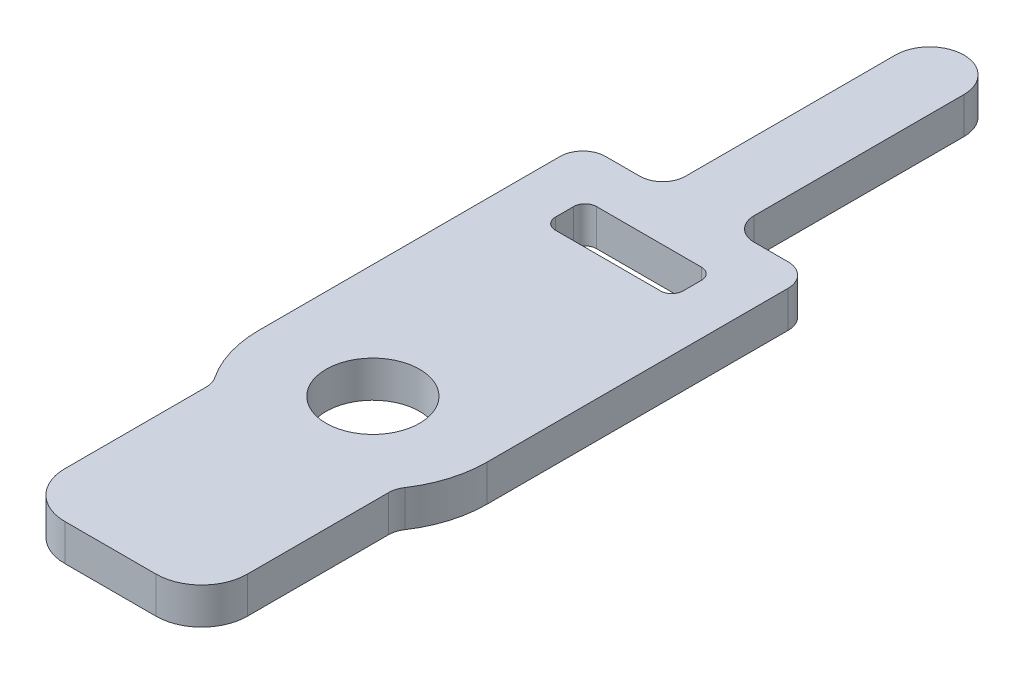
ISO-10303-21;
HEADER;
FILE_DESCRIPTION(('STEP AP214'),'2;1');
FILE_NAME('part.step','',(''),(''),'','','');
FILE_SCHEMA(('AUTOMOTIVE_DESIGN { 1 0 10303 214 1 1 1 1 }'));
ENDSEC;
DATA;
#1=APPLICATION_CONTEXT('core data for automotive mechanical design processes');
#2=APPLICATION_PROTOCOL_DEFINITION('international standard','automotive_design',2000,#1);
#3=PRODUCT_CONTEXT('',#1,'mechanical');
#4=PRODUCT('Part','Part','',(#3));
#5=PRODUCT_RELATED_PRODUCT_CATEGORY('part','',(#4));
#6=PRODUCT_DEFINITION_FORMATION('','',#4);
#7=PRODUCT_DEFINITION_CONTEXT('part definition',#1,'design');
#8=PRODUCT_DEFINITION('design','',#6,#7);
#9=PRODUCT_DEFINITION_SHAPE('','',#8);
#10=(LENGTH_UNIT() NAMED_UNIT(*) SI_UNIT(.MILLI.,.METRE.));
#11=(NAMED_UNIT(*) PLANE_ANGLE_UNIT() SI_UNIT($,.RADIAN.));
#12=(NAMED_UNIT(*) SI_UNIT($,.STERADIAN.) SOLID_ANGLE_UNIT());
#13=UNCERTAINTY_MEASURE_WITH_UNIT(LENGTH_MEASURE(1.E-05),#10,'distance_accuracy_value','');
#14=(GEOMETRIC_REPRESENTATION_CONTEXT(3) GLOBAL_UNCERTAINTY_ASSIGNED_CONTEXT((#13)) GLOBAL_UNIT_ASSIGNED_CONTEXT((#10,
#11,#12)) REPRESENTATION_CONTEXT('',''));
#15=CARTESIAN_POINT('',(0.,0.,0.));
#16=DIRECTION('',(0.,0.,1.));
#17=DIRECTION('',(1.,0.,0.));
#18=AXIS2_PLACEMENT_3D('',#15,#16,#17);
#19=CARTESIAN_POINT('',(0.,1.6,0.));
#20=DIRECTION('',(0.,0.,-1.));
#21=DIRECTION('',(-1.,0.,0.));
#22=AXIS2_PLACEMENT_3D('',#19,#20,#21);
#23=PLANE('',#22);
#24=DIRECTION('',(1.,0.,0.));
#25=VECTOR('',#24,1.);
#26=CARTESIAN_POINT('',(0.,0.,0.));
#27=LINE('',#26,#25);
#28=CARTESIAN_POINT('',(-2.00000000000001,0.,0.));
#29=VERTEX_POINT('',#28);
#30=CARTESIAN_POINT('',(2.00000000000001,0.,0.));
#31=VERTEX_POINT('',#30);
#32=EDGE_CURVE('E335',#29,#31,#27,.T.);
#33=ORIENTED_EDGE('',*,*,#32,.T.);
#34=DIRECTION('',(0.,-1.,0.));
#35=VECTOR('',#34,1.);
#36=CARTESIAN_POINT('',(2.00000000000001,1.6,0.));
#37=LINE('',#36,#35);
#38=CARTESIAN_POINT('',(2.00000000000001,1.6,0.));
#39=VERTEX_POINT('',#38);
#40=EDGE_CURVE('E396',#31,#39,#37,.F.);
#41=ORIENTED_EDGE('',*,*,#40,.T.);
#42=DIRECTION('',(1.,0.,0.));
#43=VECTOR('',#42,1.);
#44=CARTESIAN_POINT('',(0.,1.6,0.));
#45=LINE('',#44,#43);
#46=CARTESIAN_POINT('',(-2.00000000000001,1.6,0.));
#47=VERTEX_POINT('',#46);
#48=EDGE_CURVE('E336',#47,#39,#45,.T.);
#49=ORIENTED_EDGE('',*,*,#48,.F.);
#50=DIRECTION('',(0.,-1.,0.));
#51=VECTOR('',#50,1.);
#52=CARTESIAN_POINT('',(-2.00000000000001,1.6,0.));
#53=LINE('',#52,#51);
#54=EDGE_CURVE('E279',#29,#47,#53,.F.);
#55=ORIENTED_EDGE('',*,*,#54,.F.);
#56=EDGE_LOOP('',(#33,#41,#49,#55));
#57=FACE_BOUND('',#56,.T.);
#58=ADVANCED_FACE('F35',(#57),#23,.F.);
#59=CARTESIAN_POINT('',(4.00000000000001,1.6,0.));
#60=DIRECTION('',(-1.,0.,0.));
#61=DIRECTION('',(0.,0.,1.));
#62=AXIS2_PLACEMENT_3D('',#59,#60,#61);
#63=PLANE('',#62);
#64=DIRECTION('',(0.,0.,-1.));
#65=VECTOR('',#64,1.);
#66=CARTESIAN_POINT('',(4.00000000000001,0.,0.));
#67=LINE('',#66,#65);
#68=CARTESIAN_POINT('',(4.00000000000001,0.,-2.));
#69=VERTEX_POINT('',#68);
#70=CARTESIAN_POINT('',(4.00000000000001,0.,-8.1833752096446));
#71=VERTEX_POINT('',#70);
#72=EDGE_CURVE('E366',#69,#71,#67,.T.);
#73=ORIENTED_EDGE('',*,*,#72,.T.);
#74=DIRECTION('',(0.,1.,0.));
#75=VECTOR('',#74,1.);
#76=CARTESIAN_POINT('',(4.00000000000001,1.6,-8.1833752096446));
#77=LINE('',#76,#75);
#78=CARTESIAN_POINT('',(4.00000000000001,1.6,-8.1833752096446));
#79=VERTEX_POINT('',#78);
#80=EDGE_CURVE('E411',#71,#79,#77,.T.);
#81=ORIENTED_EDGE('',*,*,#80,.T.);
#82=DIRECTION('',(0.,0.,-1.));
#83=VECTOR('',#82,1.);
#84=CARTESIAN_POINT('',(4.00000000000001,1.6,0.));
#85=LINE('',#84,#83);
#86=CARTESIAN_POINT('',(4.00000000000001,1.6,-2.));
#87=VERTEX_POINT('',#86);
#88=EDGE_CURVE('E339',#87,#79,#85,.T.);
#89=ORIENTED_EDGE('',*,*,#88,.F.);
#90=DIRECTION('',(0.,-1.,0.));
#91=VECTOR('',#90,1.);
#92=CARTESIAN_POINT('',(4.00000000000001,1.6,-2.));
#93=LINE('',#92,#91);
#94=EDGE_CURVE('E391',#87,#69,#93,.T.);
#95=ORIENTED_EDGE('',*,*,#94,.T.);
#96=EDGE_LOOP('',(#73,#81,#89,#95));
#97=FACE_BOUND('',#96,.T.);
#98=ADVANCED_FACE('F490',(#97),#63,.F.);
#99=CARTESIAN_POINT('',(0.,1.6,-11.5));
#100=DIRECTION('',(0.,-1.,0.));
#101=DIRECTION('',(0.,0.,-1.));
#102=AXIS2_PLACEMENT_3D('',#99,#100,#101);
#103=CYLINDRICAL_SURFACE('',#102,5.);
#104=CARTESIAN_POINT('',(0.,1.6,-11.5));
#105=DIRECTION('',(0.,1.,0.));
#106=DIRECTION('',(0.,0.,1.));
#107=AXIS2_PLACEMENT_3D('',#104,#105,#106);
#108=CIRCLE('',#107,5.);
#109=CARTESIAN_POINT('',(4.16666666666667,1.6,-8.73614600803717));
#110=VERTEX_POINT('',#109);
#111=CARTESIAN_POINT('',(5.,1.6,-11.5));
#112=VERTEX_POINT('',#111);
#113=EDGE_CURVE('E343',#110,#112,#108,.T.);
#114=ORIENTED_EDGE('',*,*,#113,.F.);
#115=DIRECTION('',(0.,-1.,0.));
#116=VECTOR('',#115,1.);
#117=CARTESIAN_POINT('',(4.16666666666667,1.6,-8.73614600803717));
#118=LINE('',#117,#116);
#119=CARTESIAN_POINT('',(4.16666666666667,0.,-8.73614600803717));
#120=VERTEX_POINT('',#119);
#121=EDGE_CURVE('E408',#110,#120,#118,.T.);
#122=ORIENTED_EDGE('',*,*,#121,.T.);
#123=CARTESIAN_POINT('',(0.,0.,-11.5));
#124=DIRECTION('',(0.,1.,0.));
#125=DIRECTION('',(0.,0.,1.));
#126=AXIS2_PLACEMENT_3D('',#123,#124,#125);
#127=CIRCLE('',#126,5.);
#128=CARTESIAN_POINT('',(5.,0.,-11.5));
#129=VERTEX_POINT('',#128);
#130=EDGE_CURVE('E369',#120,#129,#127,.T.);
#131=ORIENTED_EDGE('',*,*,#130,.T.);
#132=DIRECTION('',(0.,-1.,0.));
#133=VECTOR('',#132,1.);
#134=CARTESIAN_POINT('',(5.,1.6,-11.5));
#135=LINE('',#134,#133);
#136=EDGE_CURVE('E363',#112,#129,#135,.T.);
#137=ORIENTED_EDGE('',*,*,#136,.F.);
#138=EDGE_LOOP('',(#114,#122,#131,#137));
#139=FACE_BOUND('',#138,.T.);
#140=ADVANCED_FACE('F496',(#139),#103,.T.);
#141=CARTESIAN_POINT('',(5.,1.6,-25.7));
#142=DIRECTION('',(-1.,0.,0.));
#143=DIRECTION('',(0.,0.,1.));
#144=AXIS2_PLACEMENT_3D('',#141,#142,#143);
#145=PLANE('',#144);
#146=DIRECTION('',(0.,0.,-1.));
#147=VECTOR('',#146,1.);
#148=CARTESIAN_POINT('',(5.,0.,-25.7));
#149=LINE('',#148,#147);
#150=CARTESIAN_POINT('',(5.,0.,-24.7));
#151=VERTEX_POINT('',#150);
#152=EDGE_CURVE('E371',#129,#151,#149,.T.);
#153=ORIENTED_EDGE('',*,*,#152,.T.);
#154=DIRECTION('',(0.,-1.,0.));
#155=VECTOR('',#154,1.);
#156=CARTESIAN_POINT('',(5.,1.6,-24.7));
#157=LINE('',#156,#155);
#158=CARTESIAN_POINT('',(5.,1.6,-24.7));
#159=VERTEX_POINT('',#158);
#160=EDGE_CURVE('E420',#151,#159,#157,.F.);
#161=ORIENTED_EDGE('',*,*,#160,.T.);
#162=DIRECTION('',(0.,0.,-1.));
#163=VECTOR('',#162,1.);
#164=CARTESIAN_POINT('',(5.,1.6,-25.7));
#165=LINE('',#164,#163);
#166=EDGE_CURVE('E345',#112,#159,#165,.T.);
#167=ORIENTED_EDGE('',*,*,#166,.F.);
#168=ORIENTED_EDGE('',*,*,#136,.T.);
#169=EDGE_LOOP('',(#153,#161,#167,#168));
#170=FACE_BOUND('',#169,.T.);
#171=ADVANCED_FACE('F574',(#170),#145,.F.);
#172=CARTESIAN_POINT('',(5.,1.6,-25.7));
#173=DIRECTION('',(0.,0.,1.));
#174=DIRECTION('',(1.,0.,0.));
#175=AXIS2_PLACEMENT_3D('',#172,#173,#174);
#176=PLANE('',#175);
#177=DIRECTION('',(-1.,0.,0.));
#178=VECTOR('',#177,1.);
#179=CARTESIAN_POINT('',(5.,1.6,-25.7));
#180=LINE('',#179,#178);
#181=CARTESIAN_POINT('',(4.,1.6,-25.7));
#182=VERTEX_POINT('',#181);
#183=CARTESIAN_POINT('',(2.5,1.6,-25.7));
#184=VERTEX_POINT('',#183);
#185=EDGE_CURVE('E348',#182,#184,#180,.T.);
#186=ORIENTED_EDGE('',*,*,#185,.F.);
#187=DIRECTION('',(0.,-1.,0.));
#188=VECTOR('',#187,1.);
#189=CARTESIAN_POINT('',(4.,1.6,-25.7));
#190=LINE('',#189,#188);
#191=CARTESIAN_POINT('',(4.,0.,-25.7));
#192=VERTEX_POINT('',#191);
#193=EDGE_CURVE('E415',#182,#192,#190,.T.);
#194=ORIENTED_EDGE('',*,*,#193,.T.);
#195=DIRECTION('',(-1.,0.,0.));
#196=VECTOR('',#195,1.);
#197=CARTESIAN_POINT('',(5.,0.,-25.7));
#198=LINE('',#197,#196);
#199=CARTESIAN_POINT('',(2.5,0.,-25.7));
#200=VERTEX_POINT('',#199);
#201=EDGE_CURVE('E374',#192,#200,#198,.T.);
#202=ORIENTED_EDGE('',*,*,#201,.T.);
#203=DIRECTION('',(0.,-1.,0.));
#204=VECTOR('',#203,1.);
#205=CARTESIAN_POINT('',(2.5,1.6,-25.7));
#206=LINE('',#205,#204);
#207=EDGE_CURVE('E413',#200,#184,#206,.F.);
#208=ORIENTED_EDGE('',*,*,#207,.T.);
#209=EDGE_LOOP('',(#186,#194,#202,#208));
#210=FACE_BOUND('',#209,.T.);
#211=ADVANCED_FACE('F524',(#210),#176,.F.);
#212=CARTESIAN_POINT('',(1.5,1.6,-25.7));
#213=DIRECTION('',(-1.,0.,0.));
#214=DIRECTION('',(0.,0.,1.));
#215=AXIS2_PLACEMENT_3D('',#212,#213,#214);
#216=PLANE('',#215);
#217=DIRECTION('',(0.,0.,-1.));
#218=VECTOR('',#217,1.);
#219=CARTESIAN_POINT('',(1.5,1.6,-25.7));
#220=LINE('',#219,#218);
#221=CARTESIAN_POINT('',(1.5,1.6,-26.7));
#222=VERTEX_POINT('',#221);
#223=CARTESIAN_POINT('',(1.5,1.6,-35.9));
#224=VERTEX_POINT('',#223);
#225=EDGE_CURVE('E351',#222,#224,#220,.T.);
#226=ORIENTED_EDGE('',*,*,#225,.F.);
#227=DIRECTION('',(0.,-1.,0.));
#228=VECTOR('',#227,1.);
#229=CARTESIAN_POINT('',(1.5,0.,-26.7));
#230=LINE('',#229,#228);
#231=CARTESIAN_POINT('',(1.5,0.,-26.7));
#232=VERTEX_POINT('',#231);
#233=EDGE_CURVE('E424',#222,#232,#230,.T.);
#234=ORIENTED_EDGE('',*,*,#233,.T.);
#235=DIRECTION('',(0.,0.,-1.));
#236=VECTOR('',#235,1.);
#237=CARTESIAN_POINT('',(1.5,0.,-25.7));
#238=LINE('',#237,#236);
#239=CARTESIAN_POINT('',(1.5,0.,-35.9));
#240=VERTEX_POINT('',#239);
#241=EDGE_CURVE('E377',#232,#240,#238,.T.);
#242=ORIENTED_EDGE('',*,*,#241,.T.);
#243=DIRECTION('',(0.,-1.,0.));
#244=VECTOR('',#243,1.);
#245=CARTESIAN_POINT('',(1.5,1.6,-35.9));
#246=LINE('',#245,#244);
#247=EDGE_CURVE('E403',#240,#224,#246,.F.);
#248=ORIENTED_EDGE('',*,*,#247,.T.);
#249=EDGE_LOOP('',(#226,#234,#242,#248));
#250=FACE_BOUND('',#249,.T.);
#251=ADVANCED_FACE('F530',(#250),#216,.F.);
#252=CARTESIAN_POINT('',(2.8,1.6,-23.6));
#253=DIRECTION('',(0.,0.,-1.));
#254=DIRECTION('',(-1.,0.,0.));
#255=AXIS2_PLACEMENT_3D('',#252,#253,#254);
#256=PLANE('',#255);
#257=DIRECTION('',(1.,0.,0.));
#258=VECTOR('',#257,1.);
#259=CARTESIAN_POINT('',(2.8,0.,-23.6));
#260=LINE('',#259,#258);
#261=CARTESIAN_POINT('',(-2.30000000000001,0.,-23.6));
#262=VERTEX_POINT('',#261);
#263=CARTESIAN_POINT('',(2.3,0.,-23.6));
#264=VERTEX_POINT('',#263);
#265=EDGE_CURVE('E379',#262,#264,#260,.T.);
#266=ORIENTED_EDGE('',*,*,#265,.T.);
#267=DIRECTION('',(0.,-1.,0.));
#268=VECTOR('',#267,1.);
#269=CARTESIAN_POINT('',(2.3,1.6,-23.6));
#270=LINE('',#269,#268);
#271=CARTESIAN_POINT('',(2.3,1.6,-23.6));
#272=VERTEX_POINT('',#271);
#273=EDGE_CURVE('E440',#264,#272,#270,.F.);
#274=ORIENTED_EDGE('',*,*,#273,.T.);
#275=DIRECTION('',(1.,0.,0.));
#276=VECTOR('',#275,1.);
#277=CARTESIAN_POINT('',(2.8,1.6,-23.6));
#278=LINE('',#277,#276);
#279=CARTESIAN_POINT('',(-2.30000000000001,1.6,-23.6));
#280=VERTEX_POINT('',#279);
#281=EDGE_CURVE('E353',#280,#272,#278,.T.);
#282=ORIENTED_EDGE('',*,*,#281,.F.);
#283=DIRECTION('',(0.,-1.,0.));
#284=VECTOR('',#283,1.);
#285=CARTESIAN_POINT('',(-2.30000000000001,1.6,-23.6));
#286=LINE('',#285,#284);
#287=EDGE_CURVE('E319',#262,#280,#286,.F.);
#288=ORIENTED_EDGE('',*,*,#287,.F.);
#289=EDGE_LOOP('',(#266,#274,#282,#288));
#290=FACE_BOUND('',#289,.T.);
#291=ADVANCED_FACE('F475',(#290),#256,.F.);
#292=CARTESIAN_POINT('',(2.8,1.6,-21.8));
#293=DIRECTION('',(1.,0.,0.));
#294=DIRECTION('',(0.,0.,-1.));
#295=AXIS2_PLACEMENT_3D('',#292,#293,#294);
#296=PLANE('',#295);
#297=DIRECTION('',(0.,0.,1.));
#298=VECTOR('',#297,1.);
#299=CARTESIAN_POINT('',(2.8,1.6,-21.8));
#300=LINE('',#299,#298);
#301=CARTESIAN_POINT('',(2.8,1.6,-23.1));
#302=VERTEX_POINT('',#301);
#303=CARTESIAN_POINT('',(2.8,1.6,-22.3));
#304=VERTEX_POINT('',#303);
#305=EDGE_CURVE('E356',#302,#304,#300,.T.);
#306=ORIENTED_EDGE('',*,*,#305,.F.);
#307=DIRECTION('',(0.,-1.,0.));
#308=VECTOR('',#307,1.);
#309=CARTESIAN_POINT('',(2.8,0.,-23.1));
#310=LINE('',#309,#308);
#311=CARTESIAN_POINT('',(2.8,0.,-23.1));
#312=VERTEX_POINT('',#311);
#313=EDGE_CURVE('E437',#302,#312,#310,.T.);
#314=ORIENTED_EDGE('',*,*,#313,.T.);
#315=DIRECTION('',(0.,0.,1.));
#316=VECTOR('',#315,1.);
#317=CARTESIAN_POINT('',(2.8,0.,-21.8));
#318=LINE('',#317,#316);
#319=CARTESIAN_POINT('',(2.8,0.,-22.3));
#320=VERTEX_POINT('',#319);
#321=EDGE_CURVE('E382',#312,#320,#318,.T.);
#322=ORIENTED_EDGE('',*,*,#321,.T.);
#323=DIRECTION('',(0.,-1.,0.));
#324=VECTOR('',#323,1.);
#325=CARTESIAN_POINT('',(2.8,1.6,-22.3));
#326=LINE('',#325,#324);
#327=EDGE_CURVE('E435',#320,#304,#326,.F.);
#328=ORIENTED_EDGE('',*,*,#327,.T.);
#329=EDGE_LOOP('',(#306,#314,#322,#328));
#330=FACE_BOUND('',#329,.T.);
#331=ADVANCED_FACE('F455',(#330),#296,.F.);
#332=CARTESIAN_POINT('',(2.8,1.6,-21.8));
#333=DIRECTION('',(0.,0.,1.));
#334=DIRECTION('',(1.,0.,0.));
#335=AXIS2_PLACEMENT_3D('',#332,#333,#334);
#336=PLANE('',#335);
#337=DIRECTION('',(-1.,0.,0.));
#338=VECTOR('',#337,1.);
#339=CARTESIAN_POINT('',(2.8,1.6,-21.8));
#340=LINE('',#339,#338);
#341=CARTESIAN_POINT('',(2.3,1.6,-21.8));
#342=VERTEX_POINT('',#341);
#343=CARTESIAN_POINT('',(-2.30000000000001,1.6,-21.8));
#344=VERTEX_POINT('',#343);
#345=EDGE_CURVE('E358',#342,#344,#340,.T.);
#346=ORIENTED_EDGE('',*,*,#345,.F.);
#347=DIRECTION('',(0.,-1.,0.));
#348=VECTOR('',#347,1.);
#349=CARTESIAN_POINT('',(2.3,0.,-21.8));
#350=LINE('',#349,#348);
#351=CARTESIAN_POINT('',(2.3,0.,-21.8));
#352=VERTEX_POINT('',#351);
#353=EDGE_CURVE('E442',#342,#352,#350,.T.);
#354=ORIENTED_EDGE('',*,*,#353,.T.);
#355=DIRECTION('',(-1.,0.,0.));
#356=VECTOR('',#355,1.);
#357=CARTESIAN_POINT('',(2.8,0.,-21.8));
#358=LINE('',#357,#356);
#359=CARTESIAN_POINT('',(-2.30000000000001,0.,-21.8));
#360=VERTEX_POINT('',#359);
#361=EDGE_CURVE('E385',#352,#360,#358,.T.);
#362=ORIENTED_EDGE('',*,*,#361,.T.);
#363=DIRECTION('',(0.,-1.,0.));
#364=VECTOR('',#363,1.);
#365=CARTESIAN_POINT('',(-2.30000000000001,0.,-21.8));
#366=LINE('',#365,#364);
#367=EDGE_CURVE('E322',#344,#360,#366,.T.);
#368=ORIENTED_EDGE('',*,*,#367,.F.);
#369=EDGE_LOOP('',(#346,#354,#362,#368));
#370=FACE_BOUND('',#369,.T.);
#371=ADVANCED_FACE('F458',(#370),#336,.F.);
#372=CARTESIAN_POINT('',(0.,1.6,-11.5));
#373=DIRECTION('',(0.,-1.,0.));
#374=DIRECTION('',(0.,0.,-1.));
#375=AXIS2_PLACEMENT_3D('',#372,#373,#374);
#376=CYLINDRICAL_SURFACE('',#375,2.05);
#377=CARTESIAN_POINT('',(0.,0.,-11.5));
#378=DIRECTION('',(0.,-1.,0.));
#379=DIRECTION('',(0.,0.,1.));
#380=AXIS2_PLACEMENT_3D('',#377,#378,#379);
#381=CIRCLE('',#380,2.05);
#382=CARTESIAN_POINT('',(0.,0.,-9.45));
#383=VERTEX_POINT('',#382);
#384=EDGE_CURVE('E340',#383,#383,#381,.T.);
#385=ORIENTED_EDGE('',*,*,#384,.T.);
#386=EDGE_LOOP('',(#385));
#387=FACE_BOUND('',#386,.T.);
#388=CARTESIAN_POINT('',(0.,1.6,-11.5));
#389=DIRECTION('',(0.,-1.,0.));
#390=DIRECTION('',(0.,0.,1.));
#391=AXIS2_PLACEMENT_3D('',#388,#389,#390);
#392=CIRCLE('',#391,2.05);
#393=CARTESIAN_POINT('',(0.,1.6,-9.45));
#394=VERTEX_POINT('',#393);
#395=EDGE_CURVE('E360',#394,#394,#392,.T.);
#396=ORIENTED_EDGE('',*,*,#395,.F.);
#397=EDGE_LOOP('',(#396));
#398=FACE_BOUND('',#397,.T.);
#399=ADVANCED_FACE('F591',(#387,#398),#376,.F.);
#400=CARTESIAN_POINT('',(0.,1.6,-11.5));
#401=DIRECTION('',(0.,1.,0.));
#402=DIRECTION('',(0.,0.,1.));
#403=AXIS2_PLACEMENT_3D('',#400,#401,#402);
#404=PLANE('',#403);
#405=CARTESIAN_POINT('',(-2.00000000000001,1.6,-2.));
#406=DIRECTION('',(0.,-1.,0.));
#407=DIRECTION('',(0.,0.,1.));
#408=AXIS2_PLACEMENT_3D('',#405,#406,#407);
#409=CIRCLE('',#408,2.);
#410=CARTESIAN_POINT('',(-4.00000000000001,1.6,-2.));
#411=VERTEX_POINT('',#410);
#412=EDGE_CURVE('E282',#47,#411,#409,.T.);
#413=ORIENTED_EDGE('',*,*,#412,.F.);
#414=ORIENTED_EDGE('',*,*,#48,.T.);
#415=CARTESIAN_POINT('',(2.00000000000001,1.6,-2.));
#416=DIRECTION('',(0.,1.,0.));
#417=DIRECTION('',(0.,0.,1.));
#418=AXIS2_PLACEMENT_3D('',#415,#416,#417);
#419=CIRCLE('',#418,2.);
#420=EDGE_CURVE('E398',#39,#87,#419,.T.);
#421=ORIENTED_EDGE('',*,*,#420,.T.);
#422=ORIENTED_EDGE('',*,*,#88,.T.);
#423=CARTESIAN_POINT('',(5.00000000000001,1.6,-8.1833752096446));
#424=DIRECTION('',(0.,1.,0.));
#425=DIRECTION('',(0.,0.,1.));
#426=AXIS2_PLACEMENT_3D('',#423,#424,#425);
#427=CIRCLE('',#426,1.);
#428=EDGE_CURVE('E429',#79,#110,#427,.F.);
#429=ORIENTED_EDGE('',*,*,#428,.T.);
#430=ORIENTED_EDGE('',*,*,#113,.T.);
#431=ORIENTED_EDGE('',*,*,#166,.T.);
#432=CARTESIAN_POINT('',(4.,1.6,-24.7));
#433=DIRECTION('',(0.,1.,0.));
#434=DIRECTION('',(0.,0.,1.));
#435=AXIS2_PLACEMENT_3D('',#432,#433,#434);
#436=CIRCLE('',#435,1.);
#437=EDGE_CURVE('E422',#159,#182,#436,.T.);
#438=ORIENTED_EDGE('',*,*,#437,.T.);
#439=ORIENTED_EDGE('',*,*,#185,.T.);
#440=CARTESIAN_POINT('',(2.5,1.6,-26.7));
#441=DIRECTION('',(0.,1.,0.));
#442=DIRECTION('',(0.,0.,1.));
#443=AXIS2_PLACEMENT_3D('',#440,#441,#442);
#444=CIRCLE('',#443,1.);
#445=EDGE_CURVE('E433',#184,#222,#444,.F.);
#446=ORIENTED_EDGE('',*,*,#445,.T.);
#447=ORIENTED_EDGE('',*,*,#225,.T.);
#448=CARTESIAN_POINT('',(0.,1.6,-35.9));
#449=DIRECTION('',(0.,1.,0.));
#450=DIRECTION('',(0.,0.,1.));
#451=AXIS2_PLACEMENT_3D('',#448,#449,#450);
#452=CIRCLE('',#451,1.5);
#453=CARTESIAN_POINT('',(-1.50000000000001,1.6,-35.9));
#454=VERTEX_POINT('',#453);
#455=EDGE_CURVE('E406',#224,#454,#452,.T.);
#456=ORIENTED_EDGE('',*,*,#455,.T.);
#457=DIRECTION('',(0.,0.,-1.));
#458=VECTOR('',#457,1.);
#459=CARTESIAN_POINT('',(-1.5,1.6,-25.7));
#460=LINE('',#459,#458);
#461=CARTESIAN_POINT('',(-1.5,1.6,-26.7));
#462=VERTEX_POINT('',#461);
#463=EDGE_CURVE('E255',#462,#454,#460,.T.);
#464=ORIENTED_EDGE('',*,*,#463,.F.);
#465=CARTESIAN_POINT('',(-2.5,1.6,-26.7));
#466=DIRECTION('',(0.,-1.,0.));
#467=DIRECTION('',(0.,0.,1.));
#468=AXIS2_PLACEMENT_3D('',#465,#466,#467);
#469=CIRCLE('',#468,1.);
#470=CARTESIAN_POINT('',(-2.5,1.6,-25.7));
#471=VERTEX_POINT('',#470);
#472=EDGE_CURVE('E311',#471,#462,#469,.F.);
#473=ORIENTED_EDGE('',*,*,#472,.F.);
#474=DIRECTION('',(1.,0.,0.));
#475=VECTOR('',#474,1.);
#476=CARTESIAN_POINT('',(-5.00000000000001,1.6,-25.7));
#477=LINE('',#476,#475);
#478=CARTESIAN_POINT('',(-4.00000000000001,1.6,-25.7));
#479=VERTEX_POINT('',#478);
#480=EDGE_CURVE('E230',#479,#471,#477,.T.);
#481=ORIENTED_EDGE('',*,*,#480,.F.);
#482=CARTESIAN_POINT('',(-4.00000000000001,1.6,-24.7));
#483=DIRECTION('',(0.,-1.,0.));
#484=DIRECTION('',(0.,0.,1.));
#485=AXIS2_PLACEMENT_3D('',#482,#483,#484);
#486=CIRCLE('',#485,1.);
#487=CARTESIAN_POINT('',(-5.00000000000001,1.6,-24.7));
#488=VERTEX_POINT('',#487);
#489=EDGE_CURVE('E226',#488,#479,#486,.T.);
#490=ORIENTED_EDGE('',*,*,#489,.F.);
#491=DIRECTION('',(0.,0.,-1.));
#492=VECTOR('',#491,1.);
#493=CARTESIAN_POINT('',(-5.00000000000001,1.6,-25.7));
#494=LINE('',#493,#492);
#495=CARTESIAN_POINT('',(-5.00000000000001,1.6,-11.5));
#496=VERTEX_POINT('',#495);
#497=EDGE_CURVE('E219',#496,#488,#494,.T.);
#498=ORIENTED_EDGE('',*,*,#497,.F.);
#499=CARTESIAN_POINT('',(0.,1.6,-11.5));
#500=DIRECTION('',(0.,-1.,0.));
#501=DIRECTION('',(0.,0.,1.));
#502=AXIS2_PLACEMENT_3D('',#499,#500,#501);
#503=CIRCLE('',#502,5.);
#504=CARTESIAN_POINT('',(-4.16666666666667,1.6,-8.73614600803717));
#505=VERTEX_POINT('',#504);
#506=EDGE_CURVE('E224',#505,#496,#503,.T.);
#507=ORIENTED_EDGE('',*,*,#506,.F.);
#508=CARTESIAN_POINT('',(-5.00000000000001,1.6,-8.1833752096446));
#509=DIRECTION('',(0.,-1.,0.));
#510=DIRECTION('',(0.,0.,1.));
#511=AXIS2_PLACEMENT_3D('',#508,#509,#510);
#512=CIRCLE('',#511,1.);
#513=CARTESIAN_POINT('',(-4.00000000000001,1.6,-8.1833752096446));
#514=VERTEX_POINT('',#513);
#515=EDGE_CURVE('E307',#514,#505,#512,.F.);
#516=ORIENTED_EDGE('',*,*,#515,.F.);
#517=DIRECTION('',(0.,0.,-1.));
#518=VECTOR('',#517,1.);
#519=CARTESIAN_POINT('',(-4.00000000000001,1.6,0.));
#520=LINE('',#519,#518);
#521=EDGE_CURVE('E247',#411,#514,#520,.T.);
#522=ORIENTED_EDGE('',*,*,#521,.F.);
#523=EDGE_LOOP('',(#413,#414,#421,#422,#429,#430,#431,#438,#439,#446,#447,#456,#464,#473,#481,
#490,#498,#507,#516,#522));
#524=FACE_BOUND('',#523,.T.);
#525=CARTESIAN_POINT('',(-2.30000000000001,1.6,-23.1));
#526=DIRECTION('',(0.,-1.,0.));
#527=DIRECTION('',(0.,0.,1.));
#528=AXIS2_PLACEMENT_3D('',#525,#526,#527);
#529=CIRCLE('',#528,0.5);
#530=CARTESIAN_POINT('',(-2.80000000000001,1.6,-23.1));
#531=VERTEX_POINT('',#530);
#532=EDGE_CURVE('E328',#280,#531,#529,.F.);
#533=ORIENTED_EDGE('',*,*,#532,.F.);
#534=ORIENTED_EDGE('',*,*,#281,.T.);
#535=CARTESIAN_POINT('',(2.3,1.6,-23.1));
#536=DIRECTION('',(0.,1.,0.));
#537=DIRECTION('',(0.,0.,1.));
#538=AXIS2_PLACEMENT_3D('',#535,#536,#537);
#539=CIRCLE('',#538,0.5);
#540=EDGE_CURVE('E446',#272,#302,#539,.F.);
#541=ORIENTED_EDGE('',*,*,#540,.T.);
#542=ORIENTED_EDGE('',*,*,#305,.T.);
#543=CARTESIAN_POINT('',(2.3,1.6,-22.3));
#544=DIRECTION('',(0.,1.,0.));
#545=DIRECTION('',(0.,0.,1.));
#546=AXIS2_PLACEMENT_3D('',#543,#544,#545);
#547=CIRCLE('',#546,0.5);
#548=EDGE_CURVE('E11',#304,#342,#547,.F.);
#549=ORIENTED_EDGE('',*,*,#548,.T.);
#550=ORIENTED_EDGE('',*,*,#345,.T.);
#551=CARTESIAN_POINT('',(-2.30000000000001,1.6,-22.3));
#552=DIRECTION('',(0.,-1.,0.));
#553=DIRECTION('',(0.,0.,1.));
#554=AXIS2_PLACEMENT_3D('',#551,#552,#553);
#555=CIRCLE('',#554,0.5);
#556=CARTESIAN_POINT('',(-2.80000000000001,1.6,-22.3));
#557=VERTEX_POINT('',#556);
#558=EDGE_CURVE('E332',#557,#344,#555,.F.);
#559=ORIENTED_EDGE('',*,*,#558,.F.);
#560=DIRECTION('',(0.,0.,1.));
#561=VECTOR('',#560,1.);
#562=CARTESIAN_POINT('',(-2.80000000000001,1.6,-21.8));
#563=LINE('',#562,#561);
#564=EDGE_CURVE('E241',#531,#557,#563,.T.);
#565=ORIENTED_EDGE('',*,*,#564,.F.);
#566=EDGE_LOOP('',(#533,#534,#541,#542,#549,#550,#559,#565));
#567=FACE_BOUND('',#566,.T.);
#568=ORIENTED_EDGE('',*,*,#395,.T.);
#569=EDGE_LOOP('',(#568));
#570=FACE_BOUND('',#569,.T.);
#571=ADVANCED_FACE('F222',(#524,#567,#570),#404,.T.);
#572=CARTESIAN_POINT('',(0.,0.,-11.5));
#573=DIRECTION('',(0.,1.,0.));
#574=DIRECTION('',(0.,0.,1.));
#575=AXIS2_PLACEMENT_3D('',#572,#573,#574);
#576=PLANE('',#575);
#577=ORIENTED_EDGE('',*,*,#32,.F.);
#578=CARTESIAN_POINT('',(-2.00000000000001,0.,-2.));
#579=DIRECTION('',(0.,-1.,0.));
#580=DIRECTION('',(0.,0.,1.));
#581=AXIS2_PLACEMENT_3D('',#578,#579,#580);
#582=CIRCLE('',#581,2.);
#583=CARTESIAN_POINT('',(-4.00000000000001,0.,-2.));
#584=VERTEX_POINT('',#583);
#585=EDGE_CURVE('E276',#584,#29,#582,.F.);
#586=ORIENTED_EDGE('',*,*,#585,.F.);
#587=DIRECTION('',(0.,0.,-1.));
#588=VECTOR('',#587,1.);
#589=CARTESIAN_POINT('',(-4.00000000000001,0.,0.));
#590=LINE('',#589,#588);
#591=CARTESIAN_POINT('',(-4.00000000000001,0.,-8.1833752096446));
#592=VERTEX_POINT('',#591);
#593=EDGE_CURVE('E260',#584,#592,#590,.T.);
#594=ORIENTED_EDGE('',*,*,#593,.T.);
#595=CARTESIAN_POINT('',(-5.00000000000001,0.,-8.1833752096446));
#596=DIRECTION('',(0.,-1.,0.));
#597=DIRECTION('',(0.,0.,1.));
#598=AXIS2_PLACEMENT_3D('',#595,#596,#597);
#599=CIRCLE('',#598,1.);
#600=CARTESIAN_POINT('',(-4.16666666666667,0.,-8.73614600803717));
#601=VERTEX_POINT('',#600);
#602=EDGE_CURVE('E305',#601,#592,#599,.T.);
#603=ORIENTED_EDGE('',*,*,#602,.F.);
#604=CARTESIAN_POINT('',(0.,0.,-11.5));
#605=DIRECTION('',(0.,-1.,0.));
#606=DIRECTION('',(0.,0.,1.));
#607=AXIS2_PLACEMENT_3D('',#604,#605,#606);
#608=CIRCLE('',#607,5.);
#609=CARTESIAN_POINT('',(-5.00000000000001,0.,-11.5));
#610=VERTEX_POINT('',#609);
#611=EDGE_CURVE('E263',#601,#610,#608,.T.);
#612=ORIENTED_EDGE('',*,*,#611,.T.);
#613=DIRECTION('',(0.,0.,-1.));
#614=VECTOR('',#613,1.);
#615=CARTESIAN_POINT('',(-5.00000000000001,0.,-25.7));
#616=LINE('',#615,#614);
#617=CARTESIAN_POINT('',(-5.00000000000001,0.,-24.7));
#618=VERTEX_POINT('',#617);
#619=EDGE_CURVE('E236',#610,#618,#616,.T.);
#620=ORIENTED_EDGE('',*,*,#619,.T.);
#621=CARTESIAN_POINT('',(-4.00000000000001,0.,-24.7));
#622=DIRECTION('',(0.,-1.,0.));
#623=DIRECTION('',(0.,0.,1.));
#624=AXIS2_PLACEMENT_3D('',#621,#622,#623);
#625=CIRCLE('',#624,1.);
#626=CARTESIAN_POINT('',(-4.00000000000001,0.,-25.7));
#627=VERTEX_POINT('',#626);
#628=EDGE_CURVE('E297',#627,#618,#625,.F.);
#629=ORIENTED_EDGE('',*,*,#628,.F.);
#630=DIRECTION('',(1.,0.,0.));
#631=VECTOR('',#630,1.);
#632=CARTESIAN_POINT('',(-5.00000000000001,0.,-25.7));
#633=LINE('',#632,#631);
#634=CARTESIAN_POINT('',(-2.5,0.,-25.7));
#635=VERTEX_POINT('',#634);
#636=EDGE_CURVE('E266',#627,#635,#633,.T.);
#637=ORIENTED_EDGE('',*,*,#636,.T.);
#638=CARTESIAN_POINT('',(-2.5,0.,-26.7));
#639=DIRECTION('',(0.,-1.,0.));
#640=DIRECTION('',(0.,0.,1.));
#641=AXIS2_PLACEMENT_3D('',#638,#639,#640);
#642=CIRCLE('',#641,1.);
#643=CARTESIAN_POINT('',(-1.5,0.,-26.7));
#644=VERTEX_POINT('',#643);
#645=EDGE_CURVE('E309',#644,#635,#642,.T.);
#646=ORIENTED_EDGE('',*,*,#645,.F.);
#647=DIRECTION('',(0.,0.,-1.));
#648=VECTOR('',#647,1.);
#649=CARTESIAN_POINT('',(-1.5,0.,-25.7));
#650=LINE('',#649,#648);
#651=CARTESIAN_POINT('',(-1.50000000000001,0.,-35.9));
#652=VERTEX_POINT('',#651);
#653=EDGE_CURVE('E269',#644,#652,#650,.T.);
#654=ORIENTED_EDGE('',*,*,#653,.T.);
#655=CARTESIAN_POINT('',(0.,0.,-35.9));
#656=DIRECTION('',(0.,1.,0.));
#657=DIRECTION('',(0.,0.,1.));
#658=AXIS2_PLACEMENT_3D('',#655,#656,#657);
#659=CIRCLE('',#658,1.5);
#660=EDGE_CURVE('E400',#652,#240,#659,.F.);
#661=ORIENTED_EDGE('',*,*,#660,.T.);
#662=ORIENTED_EDGE('',*,*,#241,.F.);
#663=CARTESIAN_POINT('',(2.5,0.,-26.7));
#664=DIRECTION('',(0.,1.,0.));
#665=DIRECTION('',(0.,0.,1.));
#666=AXIS2_PLACEMENT_3D('',#663,#664,#665);
#667=CIRCLE('',#666,1.);
#668=EDGE_CURVE('E431',#232,#200,#667,.T.);
#669=ORIENTED_EDGE('',*,*,#668,.T.);
#670=ORIENTED_EDGE('',*,*,#201,.F.);
#671=CARTESIAN_POINT('',(4.,0.,-24.7));
#672=DIRECTION('',(0.,1.,0.));
#673=DIRECTION('',(0.,0.,1.));
#674=AXIS2_PLACEMENT_3D('',#671,#672,#673);
#675=CIRCLE('',#674,1.);
#676=EDGE_CURVE('E418',#192,#151,#675,.F.);
#677=ORIENTED_EDGE('',*,*,#676,.T.);
#678=ORIENTED_EDGE('',*,*,#152,.F.);
#679=ORIENTED_EDGE('',*,*,#130,.F.);
#680=CARTESIAN_POINT('',(5.00000000000001,0.,-8.1833752096446));
#681=DIRECTION('',(0.,1.,0.));
#682=DIRECTION('',(0.,0.,1.));
#683=AXIS2_PLACEMENT_3D('',#680,#681,#682);
#684=CIRCLE('',#683,1.);
#685=EDGE_CURVE('E427',#120,#71,#684,.T.);
#686=ORIENTED_EDGE('',*,*,#685,.T.);
#687=ORIENTED_EDGE('',*,*,#72,.F.);
#688=CARTESIAN_POINT('',(2.00000000000001,0.,-2.));
#689=DIRECTION('',(0.,1.,0.));
#690=DIRECTION('',(0.,0.,1.));
#691=AXIS2_PLACEMENT_3D('',#688,#689,#690);
#692=CIRCLE('',#691,2.);
#693=EDGE_CURVE('E394',#69,#31,#692,.F.);
#694=ORIENTED_EDGE('',*,*,#693,.T.);
#695=EDGE_LOOP('',(#577,#586,#594,#603,#612,#620,#629,#637,#646,#654,#661,#662,#669,#670,#677,
#678,#679,#686,#687,#694));
#696=FACE_BOUND('',#695,.T.);
#697=ORIENTED_EDGE('',*,*,#265,.F.);
#698=CARTESIAN_POINT('',(-2.30000000000001,0.,-23.1));
#699=DIRECTION('',(0.,-1.,0.));
#700=DIRECTION('',(0.,0.,1.));
#701=AXIS2_PLACEMENT_3D('',#698,#699,#700);
#702=CIRCLE('',#701,0.5);
#703=CARTESIAN_POINT('',(-2.80000000000001,0.,-23.1));
#704=VERTEX_POINT('',#703);
#705=EDGE_CURVE('E325',#704,#262,#702,.T.);
#706=ORIENTED_EDGE('',*,*,#705,.F.);
#707=DIRECTION('',(0.,0.,1.));
#708=VECTOR('',#707,1.);
#709=CARTESIAN_POINT('',(-2.80000000000001,0.,-21.8));
#710=LINE('',#709,#708);
#711=CARTESIAN_POINT('',(-2.80000000000001,0.,-22.3));
#712=VERTEX_POINT('',#711);
#713=EDGE_CURVE('E250',#704,#712,#710,.T.);
#714=ORIENTED_EDGE('',*,*,#713,.T.);
#715=CARTESIAN_POINT('',(-2.30000000000001,0.,-22.3));
#716=DIRECTION('',(0.,-1.,0.));
#717=DIRECTION('',(0.,0.,1.));
#718=AXIS2_PLACEMENT_3D('',#715,#716,#717);
#719=CIRCLE('',#718,0.5);
#720=EDGE_CURVE('E330',#360,#712,#719,.T.);
#721=ORIENTED_EDGE('',*,*,#720,.F.);
#722=ORIENTED_EDGE('',*,*,#361,.F.);
#723=CARTESIAN_POINT('',(2.3,0.,-22.3));
#724=DIRECTION('',(0.,1.,0.));
#725=DIRECTION('',(0.,0.,1.));
#726=AXIS2_PLACEMENT_3D('',#723,#724,#725);
#727=CIRCLE('',#726,0.5);
#728=EDGE_CURVE('E43',#352,#320,#727,.T.);
#729=ORIENTED_EDGE('',*,*,#728,.T.);
#730=ORIENTED_EDGE('',*,*,#321,.F.);
#731=CARTESIAN_POINT('',(2.3,0.,-23.1));
#732=DIRECTION('',(0.,1.,0.));
#733=DIRECTION('',(0.,0.,1.));
#734=AXIS2_PLACEMENT_3D('',#731,#732,#733);
#735=CIRCLE('',#734,0.5);
#736=EDGE_CURVE('E444',#312,#264,#735,.T.);
#737=ORIENTED_EDGE('',*,*,#736,.T.);
#738=EDGE_LOOP('',(#697,#706,#714,#721,#722,#729,#730,#737));
#739=FACE_BOUND('',#738,.T.);
#740=ORIENTED_EDGE('',*,*,#384,.F.);
#741=EDGE_LOOP('',(#740));
#742=FACE_BOUND('',#741,.T.);
#743=ADVANCED_FACE('F450',(#696,#739,#742),#576,.F.);
#744=CARTESIAN_POINT('',(2.00000000000001,1.6,-2.));
#745=DIRECTION('',(0.,-1.,0.));
#746=DIRECTION('',(0.,0.,-1.));
#747=AXIS2_PLACEMENT_3D('',#744,#745,#746);
#748=CYLINDRICAL_SURFACE('',#747,2.);
#749=ORIENTED_EDGE('',*,*,#420,.F.);
#750=ORIENTED_EDGE('',*,*,#40,.F.);
#751=ORIENTED_EDGE('',*,*,#693,.F.);
#752=ORIENTED_EDGE('',*,*,#94,.F.);
#753=EDGE_LOOP('',(#749,#750,#751,#752));
#754=FACE_BOUND('',#753,.T.);
#755=ADVANCED_FACE('F501',(#754),#748,.T.);
#756=CARTESIAN_POINT('',(0.,1.6,-35.9));
#757=DIRECTION('',(0.,-1.,0.));
#758=DIRECTION('',(0.,0.,-1.));
#759=AXIS2_PLACEMENT_3D('',#756,#757,#758);
#760=CYLINDRICAL_SURFACE('',#759,1.5);
#761=ORIENTED_EDGE('',*,*,#455,.F.);
#762=ORIENTED_EDGE('',*,*,#247,.F.);
#763=ORIENTED_EDGE('',*,*,#660,.F.);
#764=DIRECTION('',(0.,-1.,0.));
#765=VECTOR('',#764,1.);
#766=CARTESIAN_POINT('',(-1.50000000000001,1.6,-35.9));
#767=LINE('',#766,#765);
#768=EDGE_CURVE('E284',#652,#454,#767,.F.);
#769=ORIENTED_EDGE('',*,*,#768,.T.);
#770=EDGE_LOOP('',(#761,#762,#763,#769));
#771=FACE_BOUND('',#770,.T.);
#772=ADVANCED_FACE('F504',(#771),#760,.T.);
#773=CARTESIAN_POINT('',(5.00000000000001,1.6,-8.1833752096446));
#774=DIRECTION('',(0.,-1.,0.));
#775=DIRECTION('',(0.,0.,-1.));
#776=AXIS2_PLACEMENT_3D('',#773,#774,#775);
#777=CYLINDRICAL_SURFACE('',#776,1.);
#778=ORIENTED_EDGE('',*,*,#428,.F.);
#779=ORIENTED_EDGE('',*,*,#80,.F.);
#780=ORIENTED_EDGE('',*,*,#685,.F.);
#781=ORIENTED_EDGE('',*,*,#121,.F.);
#782=EDGE_LOOP('',(#778,#779,#780,#781));
#783=FACE_BOUND('',#782,.T.);
#784=ADVANCED_FACE('F508',(#783),#777,.F.);
#785=CARTESIAN_POINT('',(4.,1.6,-24.7));
#786=DIRECTION('',(0.,-1.,0.));
#787=DIRECTION('',(0.,0.,-1.));
#788=AXIS2_PLACEMENT_3D('',#785,#786,#787);
#789=CYLINDRICAL_SURFACE('',#788,1.);
#790=ORIENTED_EDGE('',*,*,#437,.F.);
#791=ORIENTED_EDGE('',*,*,#160,.F.);
#792=ORIENTED_EDGE('',*,*,#676,.F.);
#793=ORIENTED_EDGE('',*,*,#193,.F.);
#794=EDGE_LOOP('',(#790,#791,#792,#793));
#795=FACE_BOUND('',#794,.T.);
#796=ADVANCED_FACE('F486',(#795),#789,.T.);
#797=CARTESIAN_POINT('',(2.5,1.6,-26.7));
#798=DIRECTION('',(0.,1.,0.));
#799=DIRECTION('',(0.,0.,1.));
#800=AXIS2_PLACEMENT_3D('',#797,#798,#799);
#801=CYLINDRICAL_SURFACE('',#800,1.);
#802=ORIENTED_EDGE('',*,*,#445,.F.);
#803=ORIENTED_EDGE('',*,*,#207,.F.);
#804=ORIENTED_EDGE('',*,*,#668,.F.);
#805=ORIENTED_EDGE('',*,*,#233,.F.);
#806=EDGE_LOOP('',(#802,#803,#804,#805));
#807=FACE_BOUND('',#806,.T.);
#808=ADVANCED_FACE('F480',(#807),#801,.F.);
#809=CARTESIAN_POINT('',(2.3,1.6,-23.1));
#810=DIRECTION('',(0.,1.,0.));
#811=DIRECTION('',(0.,0.,1.));
#812=AXIS2_PLACEMENT_3D('',#809,#810,#811);
#813=CYLINDRICAL_SURFACE('',#812,0.5);
#814=ORIENTED_EDGE('',*,*,#540,.F.);
#815=ORIENTED_EDGE('',*,*,#273,.F.);
#816=ORIENTED_EDGE('',*,*,#736,.F.);
#817=ORIENTED_EDGE('',*,*,#313,.F.);
#818=EDGE_LOOP('',(#814,#815,#816,#817));
#819=FACE_BOUND('',#818,.T.);
#820=ADVANCED_FACE('F478',(#819),#813,.F.);
#821=CARTESIAN_POINT('',(2.3,1.6,-22.3));
#822=DIRECTION('',(0.,1.,0.));
#823=DIRECTION('',(0.,0.,1.));
#824=AXIS2_PLACEMENT_3D('',#821,#822,#823);
#825=CYLINDRICAL_SURFACE('',#824,0.5);
#826=ORIENTED_EDGE('',*,*,#548,.F.);
#827=ORIENTED_EDGE('',*,*,#327,.F.);
#828=ORIENTED_EDGE('',*,*,#728,.F.);
#829=ORIENTED_EDGE('',*,*,#353,.F.);
#830=EDGE_LOOP('',(#826,#827,#828,#829));
#831=FACE_BOUND('',#830,.T.);
#832=ADVANCED_FACE('F37',(#831),#825,.F.);
#833=CARTESIAN_POINT('',(-4.00000000000001,1.6,0.));
#834=DIRECTION('',(1.,0.,0.));
#835=DIRECTION('',(0.,0.,1.));
#836=AXIS2_PLACEMENT_3D('',#833,#834,#835);
#837=PLANE('',#836);
#838=ORIENTED_EDGE('',*,*,#593,.F.);
#839=DIRECTION('',(0.,-1.,0.));
#840=VECTOR('',#839,1.);
#841=CARTESIAN_POINT('',(-4.00000000000001,1.6,-2.));
#842=LINE('',#841,#840);
#843=EDGE_CURVE('E240',#411,#584,#842,.T.);
#844=ORIENTED_EDGE('',*,*,#843,.F.);
#845=ORIENTED_EDGE('',*,*,#521,.T.);
#846=DIRECTION('',(0.,1.,0.));
#847=VECTOR('',#846,1.);
#848=CARTESIAN_POINT('',(-4.00000000000001,1.6,-8.1833752096446));
#849=LINE('',#848,#847);
#850=EDGE_CURVE('E288',#592,#514,#849,.T.);
#851=ORIENTED_EDGE('',*,*,#850,.F.);
#852=EDGE_LOOP('',(#838,#844,#845,#851));
#853=FACE_BOUND('',#852,.T.);
#854=ADVANCED_FACE('F485',(#853),#837,.F.);
#855=CARTESIAN_POINT('',(0.,1.6,-11.5));
#856=DIRECTION('',(0.,-1.,0.));
#857=DIRECTION('',(0.,0.,-1.));
#858=AXIS2_PLACEMENT_3D('',#855,#856,#857);
#859=CYLINDRICAL_SURFACE('',#858,5.);
#860=ORIENTED_EDGE('',*,*,#506,.T.);
#861=DIRECTION('',(0.,-1.,0.));
#862=VECTOR('',#861,1.);
#863=CARTESIAN_POINT('',(-5.00000000000001,1.6,-11.5));
#864=LINE('',#863,#862);
#865=EDGE_CURVE('E233',#496,#610,#864,.T.);
#866=ORIENTED_EDGE('',*,*,#865,.T.);
#867=ORIENTED_EDGE('',*,*,#611,.F.);
#868=DIRECTION('',(0.,-1.,0.));
#869=VECTOR('',#868,1.);
#870=CARTESIAN_POINT('',(-4.16666666666667,1.6,-8.73614600803717));
#871=LINE('',#870,#869);
#872=EDGE_CURVE('E246',#505,#601,#871,.T.);
#873=ORIENTED_EDGE('',*,*,#872,.F.);
#874=EDGE_LOOP('',(#860,#866,#867,#873));
#875=FACE_BOUND('',#874,.T.);
#876=ADVANCED_FACE('F244',(#875),#859,.T.);
#877=CARTESIAN_POINT('',(-5.00000000000001,1.6,-25.7));
#878=DIRECTION('',(1.,0.,0.));
#879=DIRECTION('',(0.,0.,1.));
#880=AXIS2_PLACEMENT_3D('',#877,#878,#879);
#881=PLANE('',#880);
#882=ORIENTED_EDGE('',*,*,#619,.F.);
#883=ORIENTED_EDGE('',*,*,#865,.F.);
#884=ORIENTED_EDGE('',*,*,#497,.T.);
#885=DIRECTION('',(0.,-1.,0.));
#886=VECTOR('',#885,1.);
#887=CARTESIAN_POINT('',(-5.00000000000001,1.6,-24.7));
#888=LINE('',#887,#886);
#889=EDGE_CURVE('E299',#618,#488,#888,.F.);
#890=ORIENTED_EDGE('',*,*,#889,.F.);
#891=EDGE_LOOP('',(#882,#883,#884,#890));
#892=FACE_BOUND('',#891,.T.);
#893=ADVANCED_FACE('F234',(#892),#881,.F.);
#894=CARTESIAN_POINT('',(-5.00000000000001,1.6,-25.7));
#895=DIRECTION('',(0.,0.,1.));
#896=DIRECTION('',(-1.,0.,0.));
#897=AXIS2_PLACEMENT_3D('',#894,#895,#896);
#898=PLANE('',#897);
#899=ORIENTED_EDGE('',*,*,#480,.T.);
#900=DIRECTION('',(0.,-1.,0.));
#901=VECTOR('',#900,1.);
#902=CARTESIAN_POINT('',(-2.5,1.6,-25.7));
#903=LINE('',#902,#901);
#904=EDGE_CURVE('E291',#635,#471,#903,.F.);
#905=ORIENTED_EDGE('',*,*,#904,.F.);
#906=ORIENTED_EDGE('',*,*,#636,.F.);
#907=DIRECTION('',(0.,-1.,0.));
#908=VECTOR('',#907,1.);
#909=CARTESIAN_POINT('',(-4.00000000000001,1.6,-25.7));
#910=LINE('',#909,#908);
#911=EDGE_CURVE('E294',#479,#627,#910,.T.);
#912=ORIENTED_EDGE('',*,*,#911,.F.);
#913=EDGE_LOOP('',(#899,#905,#906,#912));
#914=FACE_BOUND('',#913,.T.);
#915=ADVANCED_FACE('F546',(#914),#898,.F.);
#916=CARTESIAN_POINT('',(-1.5,1.6,-25.7));
#917=DIRECTION('',(1.,0.,0.));
#918=DIRECTION('',(0.,0.,1.));
#919=AXIS2_PLACEMENT_3D('',#916,#917,#918);
#920=PLANE('',#919);
#921=ORIENTED_EDGE('',*,*,#463,.T.);
#922=ORIENTED_EDGE('',*,*,#768,.F.);
#923=ORIENTED_EDGE('',*,*,#653,.F.);
#924=DIRECTION('',(0.,-1.,0.));
#925=VECTOR('',#924,1.);
#926=CARTESIAN_POINT('',(-1.5,0.,-26.7));
#927=LINE('',#926,#925);
#928=EDGE_CURVE('E302',#462,#644,#927,.T.);
#929=ORIENTED_EDGE('',*,*,#928,.F.);
#930=EDGE_LOOP('',(#921,#922,#923,#929));
#931=FACE_BOUND('',#930,.T.);
#932=ADVANCED_FACE('F538',(#931),#920,.F.);
#933=CARTESIAN_POINT('',(-2.80000000000001,1.6,-21.8));
#934=DIRECTION('',(-1.,0.,0.));
#935=DIRECTION('',(0.,0.,-1.));
#936=AXIS2_PLACEMENT_3D('',#933,#934,#935);
#937=PLANE('',#936);
#938=ORIENTED_EDGE('',*,*,#564,.T.);
#939=DIRECTION('',(0.,-1.,0.));
#940=VECTOR('',#939,1.);
#941=CARTESIAN_POINT('',(-2.80000000000001,1.6,-22.3));
#942=LINE('',#941,#940);
#943=EDGE_CURVE('E313',#712,#557,#942,.F.);
#944=ORIENTED_EDGE('',*,*,#943,.F.);
#945=ORIENTED_EDGE('',*,*,#713,.F.);
#946=DIRECTION('',(0.,-1.,0.));
#947=VECTOR('',#946,1.);
#948=CARTESIAN_POINT('',(-2.80000000000001,0.,-23.1));
#949=LINE('',#948,#947);
#950=EDGE_CURVE('E316',#531,#704,#949,.T.);
#951=ORIENTED_EDGE('',*,*,#950,.F.);
#952=EDGE_LOOP('',(#938,#944,#945,#951));
#953=FACE_BOUND('',#952,.T.);
#954=ADVANCED_FACE('F469',(#953),#937,.F.);
#955=CARTESIAN_POINT('',(-2.00000000000001,1.6,-2.));
#956=DIRECTION('',(0.,-1.,0.));
#957=DIRECTION('',(0.,0.,-1.));
#958=AXIS2_PLACEMENT_3D('',#955,#956,#957);
#959=CYLINDRICAL_SURFACE('',#958,2.);
#960=ORIENTED_EDGE('',*,*,#412,.T.);
#961=ORIENTED_EDGE('',*,*,#843,.T.);
#962=ORIENTED_EDGE('',*,*,#585,.T.);
#963=ORIENTED_EDGE('',*,*,#54,.T.);
#964=EDGE_LOOP('',(#960,#961,#962,#963));
#965=FACE_BOUND('',#964,.T.);
#966=ADVANCED_FACE('F558',(#965),#959,.T.);
#967=CARTESIAN_POINT('',(-5.00000000000001,1.6,-8.1833752096446));
#968=DIRECTION('',(0.,-1.,0.));
#969=DIRECTION('',(0.,0.,-1.));
#970=AXIS2_PLACEMENT_3D('',#967,#968,#969);
#971=CYLINDRICAL_SURFACE('',#970,1.);
#972=ORIENTED_EDGE('',*,*,#515,.T.);
#973=ORIENTED_EDGE('',*,*,#872,.T.);
#974=ORIENTED_EDGE('',*,*,#602,.T.);
#975=ORIENTED_EDGE('',*,*,#850,.T.);
#976=EDGE_LOOP('',(#972,#973,#974,#975));
#977=FACE_BOUND('',#976,.T.);
#978=ADVANCED_FACE('F553',(#977),#971,.F.);
#979=CARTESIAN_POINT('',(-4.00000000000001,1.6,-24.7));
#980=DIRECTION('',(0.,-1.,0.));
#981=DIRECTION('',(0.,0.,-1.));
#982=AXIS2_PLACEMENT_3D('',#979,#980,#981);
#983=CYLINDRICAL_SURFACE('',#982,1.);
#984=ORIENTED_EDGE('',*,*,#489,.T.);
#985=ORIENTED_EDGE('',*,*,#911,.T.);
#986=ORIENTED_EDGE('',*,*,#628,.T.);
#987=ORIENTED_EDGE('',*,*,#889,.T.);
#988=EDGE_LOOP('',(#984,#985,#986,#987));
#989=FACE_BOUND('',#988,.T.);
#990=ADVANCED_FACE('F548',(#989),#983,.T.);
#991=CARTESIAN_POINT('',(-2.5,1.6,-26.7));
#992=DIRECTION('',(0.,1.,0.));
#993=DIRECTION('',(0.,0.,1.));
#994=AXIS2_PLACEMENT_3D('',#991,#992,#993);
#995=CYLINDRICAL_SURFACE('',#994,1.);
#996=ORIENTED_EDGE('',*,*,#472,.T.);
#997=ORIENTED_EDGE('',*,*,#928,.T.);
#998=ORIENTED_EDGE('',*,*,#645,.T.);
#999=ORIENTED_EDGE('',*,*,#904,.T.);
#1000=EDGE_LOOP('',(#996,#997,#998,#999));
#1001=FACE_BOUND('',#1000,.T.);
#1002=ADVANCED_FACE('F541',(#1001),#995,.F.);
#1003=CARTESIAN_POINT('',(-2.30000000000001,1.6,-23.1));
#1004=DIRECTION('',(0.,1.,0.));
#1005=DIRECTION('',(0.,0.,1.));
#1006=AXIS2_PLACEMENT_3D('',#1003,#1004,#1005);
#1007=CYLINDRICAL_SURFACE('',#1006,0.5);
#1008=ORIENTED_EDGE('',*,*,#532,.T.);
#1009=ORIENTED_EDGE('',*,*,#950,.T.);
#1010=ORIENTED_EDGE('',*,*,#705,.T.);
#1011=ORIENTED_EDGE('',*,*,#287,.T.);
#1012=EDGE_LOOP('',(#1008,#1009,#1010,#1011));
#1013=FACE_BOUND('',#1012,.T.);
#1014=ADVANCED_FACE('F473',(#1013),#1007,.F.);
#1015=CARTESIAN_POINT('',(-2.30000000000001,1.6,-22.3));
#1016=DIRECTION('',(0.,1.,0.));
#1017=DIRECTION('',(0.,0.,1.));
#1018=AXIS2_PLACEMENT_3D('',#1015,#1016,#1017);
#1019=CYLINDRICAL_SURFACE('',#1018,0.5);
#1020=ORIENTED_EDGE('',*,*,#558,.T.);
#1021=ORIENTED_EDGE('',*,*,#367,.T.);
#1022=ORIENTED_EDGE('',*,*,#720,.T.);
#1023=ORIENTED_EDGE('',*,*,#943,.T.);
#1024=EDGE_LOOP('',(#1020,#1021,#1022,#1023));
#1025=FACE_BOUND('',#1024,.T.);
#1026=ADVANCED_FACE('F464',(#1025),#1019,.F.);
#1027=CLOSED_SHELL('',(#58,#98,#140,#171,#211,#251,#291,#331,#371,#399,#571,#743,#755,#772,#784,
#796,#808,#820,#832,#854,#876,#893,#915,#932,#954,#966,#978,#990,#1002,#1014,#1026));
#1028=MANIFOLD_SOLID_BREP('B2',#1027);
#1029=ADVANCED_BREP_SHAPE_REPRESENTATION('',(#18,#1028),#14);
#1030=SHAPE_DEFINITION_REPRESENTATION(#9,#1029);
ENDSEC;
END-ISO-10303-21;
